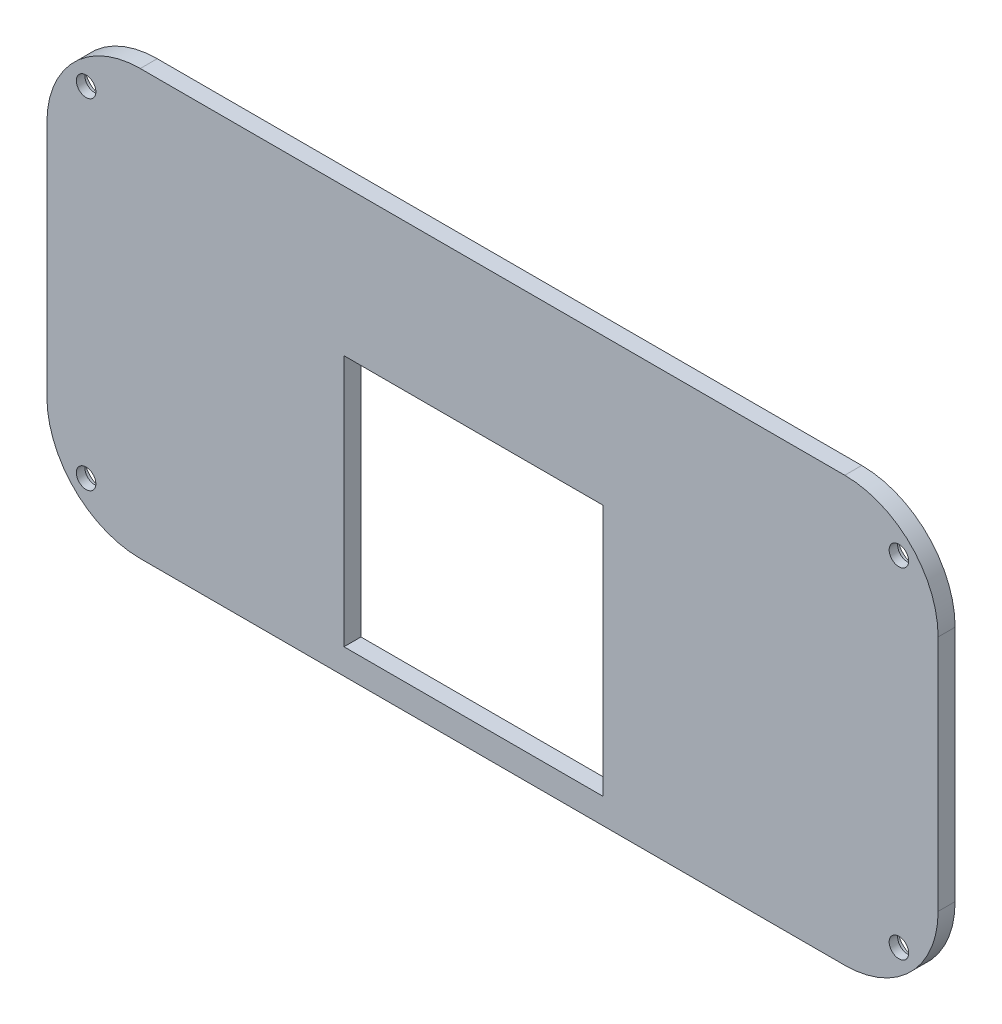
ISO-10303-21;
HEADER;
FILE_DESCRIPTION(('STEP AP214'),'2;1');
FILE_NAME('part.step','',(''),(''),'','','');
FILE_SCHEMA(('AUTOMOTIVE_DESIGN { 1 0 10303 214 1 1 1 1 }'));
ENDSEC;
DATA;
#1=APPLICATION_CONTEXT('core data for automotive mechanical design processes');
#2=APPLICATION_PROTOCOL_DEFINITION('international standard','automotive_design',2000,#1);
#3=PRODUCT_CONTEXT('',#1,'mechanical');
#4=PRODUCT('Part','Part','',(#3));
#5=PRODUCT_RELATED_PRODUCT_CATEGORY('part','',(#4));
#6=PRODUCT_DEFINITION_FORMATION('','',#4);
#7=PRODUCT_DEFINITION_CONTEXT('part definition',#1,'design');
#8=PRODUCT_DEFINITION('design','',#6,#7);
#9=PRODUCT_DEFINITION_SHAPE('','',#8);
#10=(LENGTH_UNIT() NAMED_UNIT(*) SI_UNIT(.MILLI.,.METRE.));
#11=(NAMED_UNIT(*) PLANE_ANGLE_UNIT() SI_UNIT($,.RADIAN.));
#12=(NAMED_UNIT(*) SI_UNIT($,.STERADIAN.) SOLID_ANGLE_UNIT());
#13=UNCERTAINTY_MEASURE_WITH_UNIT(LENGTH_MEASURE(1.E-05),#10,'distance_accuracy_value','');
#14=(GEOMETRIC_REPRESENTATION_CONTEXT(3) GLOBAL_UNCERTAINTY_ASSIGNED_CONTEXT((#13)) GLOBAL_UNIT_ASSIGNED_CONTEXT((#10,
#11,#12)) REPRESENTATION_CONTEXT('',''));
#15=CARTESIAN_POINT('',(0.,0.,0.));
#16=DIRECTION('',(0.,0.,1.));
#17=DIRECTION('',(1.,0.,0.));
#18=AXIS2_PLACEMENT_3D('',#15,#16,#17);
#19=CARTESIAN_POINT('',(52.5,-25.,2.));
#20=DIRECTION('',(-1.,0.,0.));
#21=DIRECTION('',(0.,0.,1.));
#22=AXIS2_PLACEMENT_3D('',#19,#20,#21);
#23=PLANE('',#22);
#24=DIRECTION('',(0.,1.,0.));
#25=VECTOR('',#24,1.);
#26=CARTESIAN_POINT('',(52.5,-25.,2.));
#27=LINE('',#26,#25);
#28=CARTESIAN_POINT('',(52.5,-14.,2.));
#29=VERTEX_POINT('',#28);
#30=CARTESIAN_POINT('',(52.5,14.,2.));
#31=VERTEX_POINT('',#30);
#32=EDGE_CURVE('E211',#29,#31,#27,.T.);
#33=ORIENTED_EDGE('',*,*,#32,.F.);
#34=DIRECTION('',(0.,0.,-1.));
#35=VECTOR('',#34,1.);
#36=CARTESIAN_POINT('',(52.5,-14.,2.));
#37=LINE('',#36,#35);
#38=CARTESIAN_POINT('',(52.5,-14.,0.));
#39=VERTEX_POINT('',#38);
#40=EDGE_CURVE('E262',#29,#39,#37,.T.);
#41=ORIENTED_EDGE('',*,*,#40,.T.);
#42=DIRECTION('',(0.,1.,0.));
#43=VECTOR('',#42,1.);
#44=CARTESIAN_POINT('',(52.5,-25.,0.));
#45=LINE('',#44,#43);
#46=CARTESIAN_POINT('',(52.5,14.,0.));
#47=VERTEX_POINT('',#46);
#48=EDGE_CURVE('E208',#39,#47,#45,.T.);
#49=ORIENTED_EDGE('',*,*,#48,.T.);
#50=DIRECTION('',(0.,0.,-1.));
#51=VECTOR('',#50,1.);
#52=CARTESIAN_POINT('',(52.5,14.,2.));
#53=LINE('',#52,#51);
#54=EDGE_CURVE('E260',#47,#31,#53,.F.);
#55=ORIENTED_EDGE('',*,*,#54,.T.);
#56=EDGE_LOOP('',(#33,#41,#49,#55));
#57=FACE_BOUND('',#56,.T.);
#58=ADVANCED_FACE('F37',(#57),#23,.F.);
#59=CARTESIAN_POINT('',(-52.5,25.,2.));
#60=DIRECTION('',(0.,-1.,0.));
#61=DIRECTION('',(0.,0.,-1.));
#62=AXIS2_PLACEMENT_3D('',#59,#60,#61);
#63=PLANE('',#62);
#64=DIRECTION('',(-1.,0.,0.));
#65=VECTOR('',#64,1.);
#66=CARTESIAN_POINT('',(-52.5,25.,2.));
#67=LINE('',#66,#65);
#68=CARTESIAN_POINT('',(41.5,25.,2.));
#69=VERTEX_POINT('',#68);
#70=CARTESIAN_POINT('',(-41.5,25.,2.));
#71=VERTEX_POINT('',#70);
#72=EDGE_CURVE('E214',#69,#71,#67,.T.);
#73=ORIENTED_EDGE('',*,*,#72,.F.);
#74=DIRECTION('',(0.,0.,-1.));
#75=VECTOR('',#74,1.);
#76=CARTESIAN_POINT('',(41.5,25.,2.));
#77=LINE('',#76,#75);
#78=CARTESIAN_POINT('',(41.5,25.,0.));
#79=VERTEX_POINT('',#78);
#80=EDGE_CURVE('E11',#69,#79,#77,.T.);
#81=ORIENTED_EDGE('',*,*,#80,.T.);
#82=DIRECTION('',(-1.,0.,0.));
#83=VECTOR('',#82,1.);
#84=CARTESIAN_POINT('',(-52.5,25.,0.));
#85=LINE('',#84,#83);
#86=CARTESIAN_POINT('',(-41.5,25.,0.));
#87=VERTEX_POINT('',#86);
#88=EDGE_CURVE('E227',#79,#87,#85,.T.);
#89=ORIENTED_EDGE('',*,*,#88,.T.);
#90=DIRECTION('',(0.,0.,-1.));
#91=VECTOR('',#90,1.);
#92=CARTESIAN_POINT('',(-41.5,25.,2.));
#93=LINE('',#92,#91);
#94=EDGE_CURVE('E45',#87,#71,#93,.F.);
#95=ORIENTED_EDGE('',*,*,#94,.T.);
#96=EDGE_LOOP('',(#73,#81,#89,#95));
#97=FACE_BOUND('',#96,.T.);
#98=ADVANCED_FACE('F267',(#97),#63,.F.);
#99=CARTESIAN_POINT('',(-52.5,-25.,2.));
#100=DIRECTION('',(1.,0.,0.));
#101=DIRECTION('',(0.,0.,-1.));
#102=AXIS2_PLACEMENT_3D('',#99,#100,#101);
#103=PLANE('',#102);
#104=DIRECTION('',(0.,-1.,0.));
#105=VECTOR('',#104,1.);
#106=CARTESIAN_POINT('',(-52.5,-25.,0.));
#107=LINE('',#106,#105);
#108=CARTESIAN_POINT('',(-52.5,14.,0.));
#109=VERTEX_POINT('',#108);
#110=CARTESIAN_POINT('',(-52.5,-14.,0.));
#111=VERTEX_POINT('',#110);
#112=EDGE_CURVE('E230',#109,#111,#107,.T.);
#113=ORIENTED_EDGE('',*,*,#112,.T.);
#114=DIRECTION('',(0.,0.,-1.));
#115=VECTOR('',#114,1.);
#116=CARTESIAN_POINT('',(-52.5,-14.,2.));
#117=LINE('',#116,#115);
#118=CARTESIAN_POINT('',(-52.5,-14.,2.));
#119=VERTEX_POINT('',#118);
#120=EDGE_CURVE('E250',#111,#119,#117,.F.);
#121=ORIENTED_EDGE('',*,*,#120,.T.);
#122=DIRECTION('',(0.,-1.,0.));
#123=VECTOR('',#122,1.);
#124=CARTESIAN_POINT('',(-52.5,-25.,2.));
#125=LINE('',#124,#123);
#126=CARTESIAN_POINT('',(-52.5,14.,2.));
#127=VERTEX_POINT('',#126);
#128=EDGE_CURVE('E218',#127,#119,#125,.T.);
#129=ORIENTED_EDGE('',*,*,#128,.F.);
#130=DIRECTION('',(0.,0.,-1.));
#131=VECTOR('',#130,1.);
#132=CARTESIAN_POINT('',(-52.5,14.,2.));
#133=LINE('',#132,#131);
#134=EDGE_CURVE('E247',#127,#109,#133,.T.);
#135=ORIENTED_EDGE('',*,*,#134,.T.);
#136=EDGE_LOOP('',(#113,#121,#129,#135));
#137=FACE_BOUND('',#136,.T.);
#138=ADVANCED_FACE('F278',(#137),#103,.F.);
#139=CARTESIAN_POINT('',(-52.5,-25.,2.));
#140=DIRECTION('',(0.,1.,0.));
#141=DIRECTION('',(0.,0.,1.));
#142=AXIS2_PLACEMENT_3D('',#139,#140,#141);
#143=PLANE('',#142);
#144=DIRECTION('',(1.,0.,0.));
#145=VECTOR('',#144,1.);
#146=CARTESIAN_POINT('',(-52.5,-25.,2.));
#147=LINE('',#146,#145);
#148=CARTESIAN_POINT('',(-41.5,-25.,2.));
#149=VERTEX_POINT('',#148);
#150=CARTESIAN_POINT('',(41.5,-25.,2.));
#151=VERTEX_POINT('',#150);
#152=EDGE_CURVE('E221',#149,#151,#147,.T.);
#153=ORIENTED_EDGE('',*,*,#152,.F.);
#154=DIRECTION('',(0.,0.,-1.));
#155=VECTOR('',#154,1.);
#156=CARTESIAN_POINT('',(-41.5,-25.,2.));
#157=LINE('',#156,#155);
#158=CARTESIAN_POINT('',(-41.5,-25.,0.));
#159=VERTEX_POINT('',#158);
#160=EDGE_CURVE('E236',#149,#159,#157,.T.);
#161=ORIENTED_EDGE('',*,*,#160,.T.);
#162=DIRECTION('',(1.,0.,0.));
#163=VECTOR('',#162,1.);
#164=CARTESIAN_POINT('',(-52.5,-25.,0.));
#165=LINE('',#164,#163);
#166=CARTESIAN_POINT('',(41.5,-25.,0.));
#167=VERTEX_POINT('',#166);
#168=EDGE_CURVE('E215',#159,#167,#165,.T.);
#169=ORIENTED_EDGE('',*,*,#168,.T.);
#170=DIRECTION('',(0.,0.,-1.));
#171=VECTOR('',#170,1.);
#172=CARTESIAN_POINT('',(41.5,-25.,2.));
#173=LINE('',#172,#171);
#174=EDGE_CURVE('E224',#167,#151,#173,.F.);
#175=ORIENTED_EDGE('',*,*,#174,.T.);
#176=EDGE_LOOP('',(#153,#161,#169,#175));
#177=FACE_BOUND('',#176,.T.);
#178=ADVANCED_FACE('F289',(#177),#143,.F.);
#179=CARTESIAN_POINT('',(0.,0.,2.));
#180=DIRECTION('',(0.,0.,-1.));
#181=DIRECTION('',(-1.,0.,0.));
#182=AXIS2_PLACEMENT_3D('',#179,#180,#181);
#183=PLANE('',#182);
#184=DIRECTION('',(-1.,0.,0.));
#185=VECTOR('',#184,1.);
#186=CARTESIAN_POINT('',(-17.5,7.69999999999999,2.));
#187=LINE('',#186,#185);
#188=CARTESIAN_POINT('',(13.,7.69999999999999,2.));
#189=VERTEX_POINT('',#188);
#190=CARTESIAN_POINT('',(-17.5,7.69999999999999,2.));
#191=VERTEX_POINT('',#190);
#192=EDGE_CURVE('E146',#189,#191,#187,.T.);
#193=ORIENTED_EDGE('',*,*,#192,.F.);
#194=DIRECTION('',(0.,1.,0.));
#195=VECTOR('',#194,1.);
#196=CARTESIAN_POINT('',(13.,-22.,2.));
#197=LINE('',#196,#195);
#198=CARTESIAN_POINT('',(13.,-22.,2.));
#199=VERTEX_POINT('',#198);
#200=EDGE_CURVE('E128',#199,#189,#197,.T.);
#201=ORIENTED_EDGE('',*,*,#200,.F.);
#202=DIRECTION('',(1.,0.,0.));
#203=VECTOR('',#202,1.);
#204=CARTESIAN_POINT('',(-17.5,-22.,2.));
#205=LINE('',#204,#203);
#206=CARTESIAN_POINT('',(-17.5,-22.,2.));
#207=VERTEX_POINT('',#206);
#208=EDGE_CURVE('E137',#207,#199,#205,.T.);
#209=ORIENTED_EDGE('',*,*,#208,.F.);
#210=DIRECTION('',(0.,-1.,0.));
#211=VECTOR('',#210,1.);
#212=CARTESIAN_POINT('',(-17.5,-22.,2.));
#213=LINE('',#212,#211);
#214=EDGE_CURVE('E52',#191,#207,#213,.T.);
#215=ORIENTED_EDGE('',*,*,#214,.F.);
#216=EDGE_LOOP('',(#193,#201,#209,#215));
#217=FACE_BOUND('',#216,.T.);
#218=CARTESIAN_POINT('',(47.8808315196469,-20.,2.));
#219=DIRECTION('',(0.,0.,-1.));
#220=DIRECTION('',(-1.,0.,0.));
#221=AXIS2_PLACEMENT_3D('',#218,#219,#220);
#222=CIRCLE('',#221,1.15);
#223=CARTESIAN_POINT('',(46.7308315196469,-20.,2.));
#224=VERTEX_POINT('',#223);
#225=EDGE_CURVE('E172',#224,#224,#222,.F.);
#226=ORIENTED_EDGE('',*,*,#225,.F.);
#227=EDGE_LOOP('',(#226));
#228=FACE_BOUND('',#227,.T.);
#229=CARTESIAN_POINT('',(-47.8808315196468,20.,2.));
#230=DIRECTION('',(0.,0.,-1.));
#231=DIRECTION('',(-1.,0.,0.));
#232=AXIS2_PLACEMENT_3D('',#229,#230,#231);
#233=CIRCLE('',#232,1.15);
#234=CARTESIAN_POINT('',(-49.0308315196468,20.,2.));
#235=VERTEX_POINT('',#234);
#236=EDGE_CURVE('E173',#235,#235,#233,.F.);
#237=ORIENTED_EDGE('',*,*,#236,.F.);
#238=EDGE_LOOP('',(#237));
#239=FACE_BOUND('',#238,.T.);
#240=CARTESIAN_POINT('',(47.8808315196469,20.,2.));
#241=DIRECTION('',(0.,0.,-1.));
#242=DIRECTION('',(-1.,0.,0.));
#243=AXIS2_PLACEMENT_3D('',#240,#241,#242);
#244=CIRCLE('',#243,1.15);
#245=CARTESIAN_POINT('',(46.7308315196469,20.,2.));
#246=VERTEX_POINT('',#245);
#247=EDGE_CURVE('E165',#246,#246,#244,.F.);
#248=ORIENTED_EDGE('',*,*,#247,.F.);
#249=EDGE_LOOP('',(#248));
#250=FACE_BOUND('',#249,.T.);
#251=CARTESIAN_POINT('',(-47.8808315196468,-20.,2.));
#252=DIRECTION('',(0.,0.,-1.));
#253=DIRECTION('',(-1.,0.,0.));
#254=AXIS2_PLACEMENT_3D('',#251,#252,#253);
#255=CIRCLE('',#254,1.15);
#256=CARTESIAN_POINT('',(-49.0308315196468,-20.,2.));
#257=VERTEX_POINT('',#256);
#258=EDGE_CURVE('E183',#257,#257,#255,.F.);
#259=ORIENTED_EDGE('',*,*,#258,.F.);
#260=EDGE_LOOP('',(#259));
#261=FACE_BOUND('',#260,.T.);
#262=ORIENTED_EDGE('',*,*,#128,.T.);
#263=CARTESIAN_POINT('',(-41.5,-14.,2.));
#264=DIRECTION('',(0.,0.,-1.));
#265=DIRECTION('',(-1.,0.,0.));
#266=AXIS2_PLACEMENT_3D('',#263,#264,#265);
#267=CIRCLE('',#266,11.);
#268=EDGE_CURVE('E258',#119,#149,#267,.F.);
#269=ORIENTED_EDGE('',*,*,#268,.T.);
#270=ORIENTED_EDGE('',*,*,#152,.T.);
#271=CARTESIAN_POINT('',(41.5,-14.,2.));
#272=DIRECTION('',(0.,0.,-1.));
#273=DIRECTION('',(-1.,0.,0.));
#274=AXIS2_PLACEMENT_3D('',#271,#272,#273);
#275=CIRCLE('',#274,11.);
#276=EDGE_CURVE('E256',#151,#29,#275,.F.);
#277=ORIENTED_EDGE('',*,*,#276,.T.);
#278=ORIENTED_EDGE('',*,*,#32,.T.);
#279=CARTESIAN_POINT('',(41.5,14.,2.));
#280=DIRECTION('',(0.,0.,-1.));
#281=DIRECTION('',(-1.,0.,0.));
#282=AXIS2_PLACEMENT_3D('',#279,#280,#281);
#283=CIRCLE('',#282,11.);
#284=EDGE_CURVE('E254',#31,#69,#283,.F.);
#285=ORIENTED_EDGE('',*,*,#284,.T.);
#286=ORIENTED_EDGE('',*,*,#72,.T.);
#287=CARTESIAN_POINT('',(-41.5,14.,2.));
#288=DIRECTION('',(0.,0.,-1.));
#289=DIRECTION('',(-1.,0.,0.));
#290=AXIS2_PLACEMENT_3D('',#287,#288,#289);
#291=CIRCLE('',#290,11.);
#292=EDGE_CURVE('E252',#71,#127,#291,.F.);
#293=ORIENTED_EDGE('',*,*,#292,.T.);
#294=EDGE_LOOP('',(#262,#269,#270,#277,#278,#285,#286,#293));
#295=FACE_BOUND('',#294,.T.);
#296=ADVANCED_FACE('F143',(#217,#228,#239,#250,#261,#295),#183,.F.);
#297=CARTESIAN_POINT('',(0.,0.,0.));
#298=DIRECTION('',(0.,0.,-1.));
#299=DIRECTION('',(-1.,0.,0.));
#300=AXIS2_PLACEMENT_3D('',#297,#298,#299);
#301=PLANE('',#300);
#302=DIRECTION('',(0.,-1.,0.));
#303=VECTOR('',#302,1.);
#304=CARTESIAN_POINT('',(13.,-22.,0.));
#305=LINE('',#304,#303);
#306=CARTESIAN_POINT('',(13.,7.69999999999999,0.));
#307=VERTEX_POINT('',#306);
#308=CARTESIAN_POINT('',(13.,-22.,0.));
#309=VERTEX_POINT('',#308);
#310=EDGE_CURVE('E60',#307,#309,#305,.T.);
#311=ORIENTED_EDGE('',*,*,#310,.F.);
#312=DIRECTION('',(1.,0.,0.));
#313=VECTOR('',#312,1.);
#314=CARTESIAN_POINT('',(-17.5,7.69999999999999,0.));
#315=LINE('',#314,#313);
#316=CARTESIAN_POINT('',(-17.5,7.69999999999999,0.));
#317=VERTEX_POINT('',#316);
#318=EDGE_CURVE('E134',#317,#307,#315,.T.);
#319=ORIENTED_EDGE('',*,*,#318,.F.);
#320=DIRECTION('',(0.,1.,0.));
#321=VECTOR('',#320,1.);
#322=CARTESIAN_POINT('',(-17.5,-22.,0.));
#323=LINE('',#322,#321);
#324=CARTESIAN_POINT('',(-17.5,-22.,0.));
#325=VERTEX_POINT('',#324);
#326=EDGE_CURVE('E154',#325,#317,#323,.T.);
#327=ORIENTED_EDGE('',*,*,#326,.F.);
#328=DIRECTION('',(-1.,0.,0.));
#329=VECTOR('',#328,1.);
#330=CARTESIAN_POINT('',(-17.5,-22.,0.));
#331=LINE('',#330,#329);
#332=EDGE_CURVE('E148',#309,#325,#331,.T.);
#333=ORIENTED_EDGE('',*,*,#332,.F.);
#334=EDGE_LOOP('',(#311,#319,#327,#333));
#335=FACE_BOUND('',#334,.T.);
#336=CARTESIAN_POINT('',(47.8808315196469,-20.,0.));
#337=DIRECTION('',(0.,0.,-1.));
#338=DIRECTION('',(-1.,0.,0.));
#339=AXIS2_PLACEMENT_3D('',#336,#337,#338);
#340=CIRCLE('',#339,2.15);
#341=CARTESIAN_POINT('',(45.7308315196469,-20.,0.));
#342=VERTEX_POINT('',#341);
#343=EDGE_CURVE('E186',#342,#342,#340,.T.);
#344=ORIENTED_EDGE('',*,*,#343,.F.);
#345=EDGE_LOOP('',(#344));
#346=FACE_BOUND('',#345,.T.);
#347=CARTESIAN_POINT('',(47.8808315196469,20.,0.));
#348=DIRECTION('',(0.,0.,-1.));
#349=DIRECTION('',(-1.,0.,0.));
#350=AXIS2_PLACEMENT_3D('',#347,#348,#349);
#351=CIRCLE('',#350,2.15);
#352=CARTESIAN_POINT('',(45.7308315196469,20.,0.));
#353=VERTEX_POINT('',#352);
#354=EDGE_CURVE('E197',#353,#353,#351,.T.);
#355=ORIENTED_EDGE('',*,*,#354,.F.);
#356=EDGE_LOOP('',(#355));
#357=FACE_BOUND('',#356,.T.);
#358=CARTESIAN_POINT('',(-47.8808315196468,20.,0.));
#359=DIRECTION('',(0.,0.,-1.));
#360=DIRECTION('',(-1.,0.,0.));
#361=AXIS2_PLACEMENT_3D('',#358,#359,#360);
#362=CIRCLE('',#361,2.15);
#363=CARTESIAN_POINT('',(-50.0308315196468,20.,0.));
#364=VERTEX_POINT('',#363);
#365=EDGE_CURVE('E191',#364,#364,#362,.T.);
#366=ORIENTED_EDGE('',*,*,#365,.F.);
#367=EDGE_LOOP('',(#366));
#368=FACE_BOUND('',#367,.T.);
#369=CARTESIAN_POINT('',(-47.8808315196468,-20.,0.));
#370=DIRECTION('',(0.,0.,-1.));
#371=DIRECTION('',(-1.,0.,0.));
#372=AXIS2_PLACEMENT_3D('',#369,#370,#371);
#373=CIRCLE('',#372,2.15);
#374=CARTESIAN_POINT('',(-50.0308315196468,-20.,0.));
#375=VERTEX_POINT('',#374);
#376=EDGE_CURVE('E190',#375,#375,#373,.T.);
#377=ORIENTED_EDGE('',*,*,#376,.F.);
#378=EDGE_LOOP('',(#377));
#379=FACE_BOUND('',#378,.T.);
#380=ORIENTED_EDGE('',*,*,#168,.F.);
#381=CARTESIAN_POINT('',(-41.5,-14.,0.));
#382=DIRECTION('',(0.,0.,-1.));
#383=DIRECTION('',(-1.,0.,0.));
#384=AXIS2_PLACEMENT_3D('',#381,#382,#383);
#385=CIRCLE('',#384,11.);
#386=EDGE_CURVE('E245',#159,#111,#385,.T.);
#387=ORIENTED_EDGE('',*,*,#386,.T.);
#388=ORIENTED_EDGE('',*,*,#112,.F.);
#389=CARTESIAN_POINT('',(-41.5,14.,0.));
#390=DIRECTION('',(0.,0.,-1.));
#391=DIRECTION('',(-1.,0.,0.));
#392=AXIS2_PLACEMENT_3D('',#389,#390,#391);
#393=CIRCLE('',#392,11.);
#394=EDGE_CURVE('E239',#109,#87,#393,.T.);
#395=ORIENTED_EDGE('',*,*,#394,.T.);
#396=ORIENTED_EDGE('',*,*,#88,.F.);
#397=CARTESIAN_POINT('',(41.5,14.,0.));
#398=DIRECTION('',(0.,0.,-1.));
#399=DIRECTION('',(-1.,0.,0.));
#400=AXIS2_PLACEMENT_3D('',#397,#398,#399);
#401=CIRCLE('',#400,11.);
#402=EDGE_CURVE('E241',#79,#47,#401,.T.);
#403=ORIENTED_EDGE('',*,*,#402,.T.);
#404=ORIENTED_EDGE('',*,*,#48,.F.);
#405=CARTESIAN_POINT('',(41.5,-14.,0.));
#406=DIRECTION('',(0.,0.,-1.));
#407=DIRECTION('',(-1.,0.,0.));
#408=AXIS2_PLACEMENT_3D('',#405,#406,#407);
#409=CIRCLE('',#408,11.);
#410=EDGE_CURVE('E243',#39,#167,#409,.T.);
#411=ORIENTED_EDGE('',*,*,#410,.T.);
#412=EDGE_LOOP('',(#380,#387,#388,#395,#396,#403,#404,#411));
#413=FACE_BOUND('',#412,.T.);
#414=ADVANCED_FACE('F282',(#335,#346,#357,#368,#379,#413),#301,.T.);
#415=CARTESIAN_POINT('',(-41.5,-14.,2.));
#416=DIRECTION('',(0.,0.,-1.));
#417=DIRECTION('',(-1.,0.,0.));
#418=AXIS2_PLACEMENT_3D('',#415,#416,#417);
#419=CYLINDRICAL_SURFACE('',#418,11.);
#420=ORIENTED_EDGE('',*,*,#268,.F.);
#421=ORIENTED_EDGE('',*,*,#120,.F.);
#422=ORIENTED_EDGE('',*,*,#386,.F.);
#423=ORIENTED_EDGE('',*,*,#160,.F.);
#424=EDGE_LOOP('',(#420,#421,#422,#423));
#425=FACE_BOUND('',#424,.T.);
#426=ADVANCED_FACE('F286',(#425),#419,.T.);
#427=CARTESIAN_POINT('',(41.5,-14.,2.));
#428=DIRECTION('',(0.,0.,-1.));
#429=DIRECTION('',(-1.,0.,0.));
#430=AXIS2_PLACEMENT_3D('',#427,#428,#429);
#431=CYLINDRICAL_SURFACE('',#430,11.);
#432=ORIENTED_EDGE('',*,*,#276,.F.);
#433=ORIENTED_EDGE('',*,*,#174,.F.);
#434=ORIENTED_EDGE('',*,*,#410,.F.);
#435=ORIENTED_EDGE('',*,*,#40,.F.);
#436=EDGE_LOOP('',(#432,#433,#434,#435));
#437=FACE_BOUND('',#436,.T.);
#438=ADVANCED_FACE('F295',(#437),#431,.T.);
#439=CARTESIAN_POINT('',(41.5,14.,2.));
#440=DIRECTION('',(0.,0.,-1.));
#441=DIRECTION('',(-1.,0.,0.));
#442=AXIS2_PLACEMENT_3D('',#439,#440,#441);
#443=CYLINDRICAL_SURFACE('',#442,11.);
#444=ORIENTED_EDGE('',*,*,#284,.F.);
#445=ORIENTED_EDGE('',*,*,#54,.F.);
#446=ORIENTED_EDGE('',*,*,#402,.F.);
#447=ORIENTED_EDGE('',*,*,#80,.F.);
#448=EDGE_LOOP('',(#444,#445,#446,#447));
#449=FACE_BOUND('',#448,.T.);
#450=ADVANCED_FACE('F300',(#449),#443,.T.);
#451=CARTESIAN_POINT('',(-41.5,14.,2.));
#452=DIRECTION('',(0.,0.,-1.));
#453=DIRECTION('',(-1.,0.,0.));
#454=AXIS2_PLACEMENT_3D('',#451,#452,#453);
#455=CYLINDRICAL_SURFACE('',#454,11.);
#456=ORIENTED_EDGE('',*,*,#292,.F.);
#457=ORIENTED_EDGE('',*,*,#94,.F.);
#458=ORIENTED_EDGE('',*,*,#394,.F.);
#459=ORIENTED_EDGE('',*,*,#134,.F.);
#460=EDGE_LOOP('',(#456,#457,#458,#459));
#461=FACE_BOUND('',#460,.T.);
#462=ADVANCED_FACE('F39',(#461),#455,.T.);
#463=CARTESIAN_POINT('',(-47.8808315196468,-20.,1.));
#464=DIRECTION('',(0.,0.,-1.));
#465=DIRECTION('',(-1.,0.,0.));
#466=AXIS2_PLACEMENT_3D('',#463,#464,#465);
#467=CYLINDRICAL_SURFACE('',#466,2.15);
#468=CARTESIAN_POINT('',(-47.8808315196468,-20.,1.));
#469=DIRECTION('',(0.,0.,-1.));
#470=DIRECTION('',(-1.,0.,0.));
#471=AXIS2_PLACEMENT_3D('',#468,#469,#470);
#472=CIRCLE('',#471,2.15);
#473=CARTESIAN_POINT('',(-50.0308315196468,-20.,1.));
#474=VERTEX_POINT('',#473);
#475=EDGE_CURVE('E205',#474,#474,#472,.T.);
#476=ORIENTED_EDGE('',*,*,#475,.F.);
#477=EDGE_LOOP('',(#476));
#478=FACE_BOUND('',#477,.T.);
#479=ORIENTED_EDGE('',*,*,#376,.T.);
#480=EDGE_LOOP('',(#479));
#481=FACE_BOUND('',#480,.T.);
#482=ADVANCED_FACE('F306',(#478,#481),#467,.F.);
#483=CARTESIAN_POINT('',(-47.8808315196468,-20.,1.));
#484=DIRECTION('',(0.,0.,-1.));
#485=DIRECTION('',(-1.,0.,0.));
#486=AXIS2_PLACEMENT_3D('',#483,#484,#485);
#487=PLANE('',#486);
#488=CARTESIAN_POINT('',(-47.8808315196468,-20.,1.));
#489=DIRECTION('',(0.,0.,-1.));
#490=DIRECTION('',(-1.,0.,0.));
#491=AXIS2_PLACEMENT_3D('',#488,#489,#490);
#492=CIRCLE('',#491,1.15);
#493=CARTESIAN_POINT('',(-49.0308315196468,-20.,1.));
#494=VERTEX_POINT('',#493);
#495=EDGE_CURVE('E176',#494,#494,#492,.T.);
#496=ORIENTED_EDGE('',*,*,#495,.F.);
#497=EDGE_LOOP('',(#496));
#498=FACE_BOUND('',#497,.T.);
#499=ORIENTED_EDGE('',*,*,#475,.T.);
#500=EDGE_LOOP('',(#499));
#501=FACE_BOUND('',#500,.T.);
#502=ADVANCED_FACE('F417',(#498,#501),#487,.T.);
#503=CARTESIAN_POINT('',(-47.8808315196468,20.,1.));
#504=DIRECTION('',(0.,0.,-1.));
#505=DIRECTION('',(-1.,0.,0.));
#506=AXIS2_PLACEMENT_3D('',#503,#504,#505);
#507=CYLINDRICAL_SURFACE('',#506,2.15);
#508=CARTESIAN_POINT('',(-47.8808315196468,20.,1.));
#509=DIRECTION('',(0.,0.,-1.));
#510=DIRECTION('',(-1.,0.,0.));
#511=AXIS2_PLACEMENT_3D('',#508,#509,#510);
#512=CIRCLE('',#511,2.15);
#513=CARTESIAN_POINT('',(-50.0308315196468,20.,1.));
#514=VERTEX_POINT('',#513);
#515=EDGE_CURVE('E187',#514,#514,#512,.T.);
#516=ORIENTED_EDGE('',*,*,#515,.F.);
#517=EDGE_LOOP('',(#516));
#518=FACE_BOUND('',#517,.T.);
#519=ORIENTED_EDGE('',*,*,#365,.T.);
#520=EDGE_LOOP('',(#519));
#521=FACE_BOUND('',#520,.T.);
#522=ADVANCED_FACE('F413',(#518,#521),#507,.F.);
#523=CARTESIAN_POINT('',(-47.8808315196468,20.,1.));
#524=DIRECTION('',(0.,0.,-1.));
#525=DIRECTION('',(-1.,0.,0.));
#526=AXIS2_PLACEMENT_3D('',#523,#524,#525);
#527=PLANE('',#526);
#528=CARTESIAN_POINT('',(-47.8808315196468,20.,1.));
#529=DIRECTION('',(0.,0.,-1.));
#530=DIRECTION('',(-1.,0.,0.));
#531=AXIS2_PLACEMENT_3D('',#528,#529,#530);
#532=CIRCLE('',#531,1.15);
#533=CARTESIAN_POINT('',(-49.0308315196468,20.,1.));
#534=VERTEX_POINT('',#533);
#535=EDGE_CURVE('E168',#534,#534,#532,.T.);
#536=ORIENTED_EDGE('',*,*,#535,.F.);
#537=EDGE_LOOP('',(#536));
#538=FACE_BOUND('',#537,.T.);
#539=ORIENTED_EDGE('',*,*,#515,.T.);
#540=EDGE_LOOP('',(#539));
#541=FACE_BOUND('',#540,.T.);
#542=ADVANCED_FACE('F409',(#538,#541),#527,.T.);
#543=CARTESIAN_POINT('',(47.8808315196469,20.,1.));
#544=DIRECTION('',(0.,0.,-1.));
#545=DIRECTION('',(-1.,0.,0.));
#546=AXIS2_PLACEMENT_3D('',#543,#544,#545);
#547=CYLINDRICAL_SURFACE('',#546,2.15);
#548=CARTESIAN_POINT('',(47.8808315196469,20.,1.));
#549=DIRECTION('',(0.,0.,-1.));
#550=DIRECTION('',(-1.,0.,0.));
#551=AXIS2_PLACEMENT_3D('',#548,#549,#550);
#552=CIRCLE('',#551,2.15);
#553=CARTESIAN_POINT('',(45.7308315196469,20.,1.));
#554=VERTEX_POINT('',#553);
#555=EDGE_CURVE('E194',#554,#554,#552,.T.);
#556=ORIENTED_EDGE('',*,*,#555,.F.);
#557=EDGE_LOOP('',(#556));
#558=FACE_BOUND('',#557,.T.);
#559=ORIENTED_EDGE('',*,*,#354,.T.);
#560=EDGE_LOOP('',(#559));
#561=FACE_BOUND('',#560,.T.);
#562=ADVANCED_FACE('F412',(#558,#561),#547,.F.);
#563=CARTESIAN_POINT('',(47.8808315196469,20.,1.));
#564=DIRECTION('',(0.,0.,-1.));
#565=DIRECTION('',(-1.,0.,0.));
#566=AXIS2_PLACEMENT_3D('',#563,#564,#565);
#567=PLANE('',#566);
#568=CARTESIAN_POINT('',(47.8808315196469,20.,1.));
#569=DIRECTION('',(0.,0.,-1.));
#570=DIRECTION('',(-1.,0.,0.));
#571=AXIS2_PLACEMENT_3D('',#568,#569,#570);
#572=CIRCLE('',#571,1.15);
#573=CARTESIAN_POINT('',(46.7308315196469,20.,1.));
#574=VERTEX_POINT('',#573);
#575=EDGE_CURVE('E140',#574,#574,#572,.T.);
#576=ORIENTED_EDGE('',*,*,#575,.F.);
#577=EDGE_LOOP('',(#576));
#578=FACE_BOUND('',#577,.T.);
#579=ORIENTED_EDGE('',*,*,#555,.T.);
#580=EDGE_LOOP('',(#579));
#581=FACE_BOUND('',#580,.T.);
#582=ADVANCED_FACE('F419',(#578,#581),#567,.T.);
#583=CARTESIAN_POINT('',(47.8808315196469,-20.,1.));
#584=DIRECTION('',(0.,0.,-1.));
#585=DIRECTION('',(-1.,0.,0.));
#586=AXIS2_PLACEMENT_3D('',#583,#584,#585);
#587=CYLINDRICAL_SURFACE('',#586,2.15);
#588=CARTESIAN_POINT('',(47.8808315196469,-20.,1.));
#589=DIRECTION('',(0.,0.,-1.));
#590=DIRECTION('',(-1.,0.,0.));
#591=AXIS2_PLACEMENT_3D('',#588,#589,#590);
#592=CIRCLE('',#591,2.15);
#593=CARTESIAN_POINT('',(45.7308315196469,-20.,1.));
#594=VERTEX_POINT('',#593);
#595=EDGE_CURVE('E200',#594,#594,#592,.T.);
#596=ORIENTED_EDGE('',*,*,#595,.F.);
#597=EDGE_LOOP('',(#596));
#598=FACE_BOUND('',#597,.T.);
#599=ORIENTED_EDGE('',*,*,#343,.T.);
#600=EDGE_LOOP('',(#599));
#601=FACE_BOUND('',#600,.T.);
#602=ADVANCED_FACE('F422',(#598,#601),#587,.F.);
#603=CARTESIAN_POINT('',(47.8808315196469,-20.,1.));
#604=DIRECTION('',(0.,0.,-1.));
#605=DIRECTION('',(-1.,0.,0.));
#606=AXIS2_PLACEMENT_3D('',#603,#604,#605);
#607=PLANE('',#606);
#608=CARTESIAN_POINT('',(47.8808315196469,-20.,1.));
#609=DIRECTION('',(0.,0.,-1.));
#610=DIRECTION('',(-1.,0.,0.));
#611=AXIS2_PLACEMENT_3D('',#608,#609,#610);
#612=CIRCLE('',#611,1.15);
#613=CARTESIAN_POINT('',(46.7308315196469,-20.,1.));
#614=VERTEX_POINT('',#613);
#615=EDGE_CURVE('E169',#614,#614,#612,.T.);
#616=ORIENTED_EDGE('',*,*,#615,.F.);
#617=EDGE_LOOP('',(#616));
#618=FACE_BOUND('',#617,.T.);
#619=ORIENTED_EDGE('',*,*,#595,.T.);
#620=EDGE_LOOP('',(#619));
#621=FACE_BOUND('',#620,.T.);
#622=ADVANCED_FACE('F407',(#618,#621),#607,.T.);
#623=CARTESIAN_POINT('',(-47.8808315196468,-20.,2.001));
#624=DIRECTION('',(0.,0.,-1.));
#625=DIRECTION('',(-1.,0.,0.));
#626=AXIS2_PLACEMENT_3D('',#623,#624,#625);
#627=CYLINDRICAL_SURFACE('',#626,1.15);
#628=ORIENTED_EDGE('',*,*,#495,.T.);
#629=EDGE_LOOP('',(#628));
#630=FACE_BOUND('',#629,.T.);
#631=ORIENTED_EDGE('',*,*,#258,.T.);
#632=EDGE_LOOP('',(#631));
#633=FACE_BOUND('',#632,.T.);
#634=ADVANCED_FACE('F398',(#630,#633),#627,.F.);
#635=CARTESIAN_POINT('',(47.8808315196469,20.,2.001));
#636=DIRECTION('',(0.,0.,-1.));
#637=DIRECTION('',(-1.,0.,0.));
#638=AXIS2_PLACEMENT_3D('',#635,#636,#637);
#639=CYLINDRICAL_SURFACE('',#638,1.15);
#640=ORIENTED_EDGE('',*,*,#575,.T.);
#641=EDGE_LOOP('',(#640));
#642=FACE_BOUND('',#641,.T.);
#643=ORIENTED_EDGE('',*,*,#247,.T.);
#644=EDGE_LOOP('',(#643));
#645=FACE_BOUND('',#644,.T.);
#646=ADVANCED_FACE('F394',(#642,#645),#639,.F.);
#647=CARTESIAN_POINT('',(-47.8808315196468,20.,2.001));
#648=DIRECTION('',(0.,0.,-1.));
#649=DIRECTION('',(-1.,0.,0.));
#650=AXIS2_PLACEMENT_3D('',#647,#648,#649);
#651=CYLINDRICAL_SURFACE('',#650,1.15);
#652=ORIENTED_EDGE('',*,*,#535,.T.);
#653=EDGE_LOOP('',(#652));
#654=FACE_BOUND('',#653,.T.);
#655=ORIENTED_EDGE('',*,*,#236,.T.);
#656=EDGE_LOOP('',(#655));
#657=FACE_BOUND('',#656,.T.);
#658=ADVANCED_FACE('F397',(#654,#657),#651,.F.);
#659=CARTESIAN_POINT('',(47.8808315196469,-20.,2.001));
#660=DIRECTION('',(0.,0.,-1.));
#661=DIRECTION('',(-1.,0.,0.));
#662=AXIS2_PLACEMENT_3D('',#659,#660,#661);
#663=CYLINDRICAL_SURFACE('',#662,1.15);
#664=ORIENTED_EDGE('',*,*,#615,.T.);
#665=EDGE_LOOP('',(#664));
#666=FACE_BOUND('',#665,.T.);
#667=ORIENTED_EDGE('',*,*,#225,.T.);
#668=EDGE_LOOP('',(#667));
#669=FACE_BOUND('',#668,.T.);
#670=ADVANCED_FACE('F349',(#666,#669),#663,.F.);
#671=CARTESIAN_POINT('',(13.,-22.,2.001));
#672=DIRECTION('',(1.,0.,0.));
#673=DIRECTION('',(0.,1.,0.));
#674=AXIS2_PLACEMENT_3D('',#671,#672,#673);
#675=PLANE('',#674);
#676=ORIENTED_EDGE('',*,*,#200,.T.);
#677=DIRECTION('',(0.,0.,-1.));
#678=VECTOR('',#677,1.);
#679=CARTESIAN_POINT('',(13.,7.69999999999999,2.001));
#680=LINE('',#679,#678);
#681=EDGE_CURVE('E141',#189,#307,#680,.T.);
#682=ORIENTED_EDGE('',*,*,#681,.T.);
#683=ORIENTED_EDGE('',*,*,#310,.T.);
#684=DIRECTION('',(0.,0.,-1.));
#685=VECTOR('',#684,1.);
#686=CARTESIAN_POINT('',(13.,-22.,2.001));
#687=LINE('',#686,#685);
#688=EDGE_CURVE('E124',#199,#309,#687,.T.);
#689=ORIENTED_EDGE('',*,*,#688,.F.);
#690=EDGE_LOOP('',(#676,#682,#683,#689));
#691=FACE_BOUND('',#690,.T.);
#692=ADVANCED_FACE('F126',(#691),#675,.F.);
#693=CARTESIAN_POINT('',(-17.5,7.69999999999999,2.001));
#694=DIRECTION('',(0.,1.,0.));
#695=DIRECTION('',(0.,0.,1.));
#696=AXIS2_PLACEMENT_3D('',#693,#694,#695);
#697=PLANE('',#696);
#698=ORIENTED_EDGE('',*,*,#192,.T.);
#699=DIRECTION('',(0.,0.,-1.));
#700=VECTOR('',#699,1.);
#701=CARTESIAN_POINT('',(-17.5,7.69999999999999,2.001));
#702=LINE('',#701,#700);
#703=EDGE_CURVE('E160',#191,#317,#702,.T.);
#704=ORIENTED_EDGE('',*,*,#703,.T.);
#705=ORIENTED_EDGE('',*,*,#318,.T.);
#706=ORIENTED_EDGE('',*,*,#681,.F.);
#707=EDGE_LOOP('',(#698,#704,#705,#706));
#708=FACE_BOUND('',#707,.T.);
#709=ADVANCED_FACE('F363',(#708),#697,.F.);
#710=CARTESIAN_POINT('',(-17.5,-22.,2.001));
#711=DIRECTION('',(-1.,0.,0.));
#712=DIRECTION('',(0.,0.,1.));
#713=AXIS2_PLACEMENT_3D('',#710,#711,#712);
#714=PLANE('',#713);
#715=ORIENTED_EDGE('',*,*,#214,.T.);
#716=DIRECTION('',(0.,0.,-1.));
#717=VECTOR('',#716,1.);
#718=CARTESIAN_POINT('',(-17.5,-22.,2.001));
#719=LINE('',#718,#717);
#720=EDGE_CURVE('E133',#207,#325,#719,.T.);
#721=ORIENTED_EDGE('',*,*,#720,.T.);
#722=ORIENTED_EDGE('',*,*,#326,.T.);
#723=ORIENTED_EDGE('',*,*,#703,.F.);
#724=EDGE_LOOP('',(#715,#721,#722,#723));
#725=FACE_BOUND('',#724,.T.);
#726=ADVANCED_FACE('F372',(#725),#714,.F.);
#727=CARTESIAN_POINT('',(-17.5,-22.,2.001));
#728=DIRECTION('',(0.,-1.,0.));
#729=DIRECTION('',(0.,0.,-1.));
#730=AXIS2_PLACEMENT_3D('',#727,#728,#729);
#731=PLANE('',#730);
#732=ORIENTED_EDGE('',*,*,#208,.T.);
#733=ORIENTED_EDGE('',*,*,#688,.T.);
#734=ORIENTED_EDGE('',*,*,#332,.T.);
#735=ORIENTED_EDGE('',*,*,#720,.F.);
#736=EDGE_LOOP('',(#732,#733,#734,#735));
#737=FACE_BOUND('',#736,.T.);
#738=ADVANCED_FACE('F138',(#737),#731,.F.);
#739=CLOSED_SHELL('',(#58,#98,#138,#178,#296,#414,#426,#438,#450,#462,#482,#502,#522,#542,#562,
#582,#602,#622,#634,#646,#658,#670,#692,#709,#726,#738));
#740=MANIFOLD_SOLID_BREP('B2',#739);
#741=ADVANCED_BREP_SHAPE_REPRESENTATION('',(#18,#740),#14);
#742=SHAPE_DEFINITION_REPRESENTATION(#9,#741);
ENDSEC;
END-ISO-10303-21;
